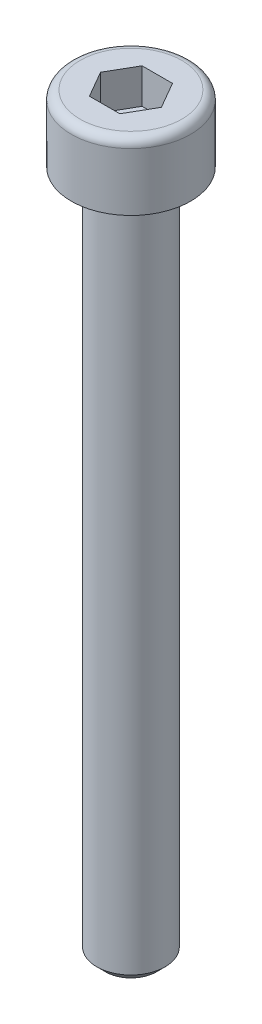
ISO-10303-21;
HEADER;
FILE_DESCRIPTION(('STEP AP214'),'2;1');
FILE_NAME('part.step','',(''),(''),'','','');
FILE_SCHEMA(('AUTOMOTIVE_DESIGN { 1 0 10303 214 1 1 1 1 }'));
ENDSEC;
DATA;
#1=APPLICATION_CONTEXT('core data for automotive mechanical design processes');
#2=APPLICATION_PROTOCOL_DEFINITION('international standard','automotive_design',2000,#1);
#3=PRODUCT_CONTEXT('',#1,'mechanical');
#4=PRODUCT('Part','Part','',(#3));
#5=PRODUCT_RELATED_PRODUCT_CATEGORY('part','',(#4));
#6=PRODUCT_DEFINITION_FORMATION('','',#4);
#7=PRODUCT_DEFINITION_CONTEXT('part definition',#1,'design');
#8=PRODUCT_DEFINITION('design','',#6,#7);
#9=PRODUCT_DEFINITION_SHAPE('','',#8);
#10=(LENGTH_UNIT() NAMED_UNIT(*) SI_UNIT(.MILLI.,.METRE.));
#11=(NAMED_UNIT(*) PLANE_ANGLE_UNIT() SI_UNIT($,.RADIAN.));
#12=(NAMED_UNIT(*) SI_UNIT($,.STERADIAN.) SOLID_ANGLE_UNIT());
#13=UNCERTAINTY_MEASURE_WITH_UNIT(LENGTH_MEASURE(1.E-05),#10,'distance_accuracy_value','');
#14=(GEOMETRIC_REPRESENTATION_CONTEXT(3) GLOBAL_UNCERTAINTY_ASSIGNED_CONTEXT((#13)) GLOBAL_UNIT_ASSIGNED_CONTEXT((#10,
#11,#12)) REPRESENTATION_CONTEXT('',''));
#15=CARTESIAN_POINT('',(0.,0.,0.));
#16=DIRECTION('',(0.,0.,1.));
#17=DIRECTION('',(1.,0.,0.));
#18=AXIS2_PLACEMENT_3D('',#15,#16,#17);
#19=CARTESIAN_POINT('',(0.,3.8,0.));
#20=DIRECTION('',(0.,1.,0.));
#21=DIRECTION('',(-1.,0.,0.));
#22=AXIS2_PLACEMENT_3D('',#19,#20,#21);
#23=PLANE('',#22);
#24=DIRECTION('',(0.5,0.,-0.866025403784439));
#25=VECTOR('',#24,1.);
#26=CARTESIAN_POINT('',(0.866025403784438,3.8,1.5));
#27=LINE('',#26,#25);
#28=CARTESIAN_POINT('',(0.866025403784438,3.8,1.5));
#29=VERTEX_POINT('',#28);
#30=CARTESIAN_POINT('',(1.73205080756888,3.8,0.));
#31=VERTEX_POINT('',#30);
#32=EDGE_CURVE('E44',#29,#31,#27,.T.);
#33=ORIENTED_EDGE('',*,*,#32,.F.);
#34=DIRECTION('',(1.,0.,0.));
#35=VECTOR('',#34,1.);
#36=CARTESIAN_POINT('',(-0.86602540378444,3.8,1.5));
#37=LINE('',#36,#35);
#38=CARTESIAN_POINT('',(-0.86602540378444,3.8,1.5));
#39=VERTEX_POINT('',#38);
#40=EDGE_CURVE('E127',#39,#29,#37,.T.);
#41=ORIENTED_EDGE('',*,*,#40,.F.);
#42=DIRECTION('',(0.5,0.,0.866025403784439));
#43=VECTOR('',#42,1.);
#44=CARTESIAN_POINT('',(-1.73205080756888,3.8,0.));
#45=LINE('',#44,#43);
#46=CARTESIAN_POINT('',(-1.73205080756888,3.8,0.));
#47=VERTEX_POINT('',#46);
#48=EDGE_CURVE('E125',#47,#39,#45,.T.);
#49=ORIENTED_EDGE('',*,*,#48,.F.);
#50=DIRECTION('',(-0.5,0.,0.866025403784439));
#51=VECTOR('',#50,1.);
#52=CARTESIAN_POINT('',(-0.866025403784439,3.8,-1.5));
#53=LINE('',#52,#51);
#54=CARTESIAN_POINT('',(-0.866025403784439,3.8,-1.5));
#55=VERTEX_POINT('',#54);
#56=EDGE_CURVE('E92',#55,#47,#53,.T.);
#57=ORIENTED_EDGE('',*,*,#56,.F.);
#58=DIRECTION('',(-1.,0.,0.));
#59=VECTOR('',#58,1.);
#60=CARTESIAN_POINT('',(0.866025403784439,3.8,-1.5));
#61=LINE('',#60,#59);
#62=CARTESIAN_POINT('',(0.866025403784439,3.8,-1.5));
#63=VERTEX_POINT('',#62);
#64=EDGE_CURVE('E121',#63,#55,#61,.T.);
#65=ORIENTED_EDGE('',*,*,#64,.F.);
#66=DIRECTION('',(-0.5,0.,-0.866025403784439));
#67=VECTOR('',#66,1.);
#68=CARTESIAN_POINT('',(1.73205080756888,3.8,0.));
#69=LINE('',#68,#67);
#70=EDGE_CURVE('E118',#31,#63,#69,.T.);
#71=ORIENTED_EDGE('',*,*,#70,.F.);
#72=EDGE_LOOP('',(#33,#41,#49,#57,#65,#71));
#73=FACE_BOUND('',#72,.T.);
#74=CARTESIAN_POINT('',(0.,3.8,0.));
#75=DIRECTION('',(0.,1.,0.));
#76=DIRECTION('',(-1.,0.,0.));
#77=AXIS2_PLACEMENT_3D('',#74,#75,#76);
#78=CIRCLE('',#77,2.9);
#79=CARTESIAN_POINT('',(-2.9,3.8,0.));
#80=VERTEX_POINT('',#79);
#81=EDGE_CURVE('E11',#80,#80,#78,.T.);
#82=ORIENTED_EDGE('',*,*,#81,.T.);
#83=EDGE_LOOP('',(#82));
#84=FACE_BOUND('',#83,.T.);
#85=ADVANCED_FACE('F30',(#73,#84),#23,.T.);
#86=CARTESIAN_POINT('',(0.,3.3,0.));
#87=DIRECTION('',(0.,1.,0.));
#88=DIRECTION('',(-1.,0.,0.));
#89=AXIS2_PLACEMENT_3D('',#86,#87,#88);
#90=TOROIDAL_SURFACE('',#89,2.9,0.5);
#91=CARTESIAN_POINT('',(0.,3.3,0.));
#92=DIRECTION('',(0.,1.,0.));
#93=DIRECTION('',(-1.,0.,0.));
#94=AXIS2_PLACEMENT_3D('',#91,#92,#93);
#95=CIRCLE('',#94,3.4);
#96=CARTESIAN_POINT('',(-3.4,3.3,0.));
#97=VERTEX_POINT('',#96);
#98=EDGE_CURVE('E37',#97,#97,#95,.T.);
#99=ORIENTED_EDGE('',*,*,#98,.T.);
#100=EDGE_LOOP('',(#99));
#101=FACE_BOUND('',#100,.T.);
#102=ORIENTED_EDGE('',*,*,#81,.F.);
#103=EDGE_LOOP('',(#102));
#104=FACE_BOUND('',#103,.T.);
#105=ADVANCED_FACE('F150',(#101,#104),#90,.T.);
#106=CARTESIAN_POINT('',(0.,3.8,0.));
#107=DIRECTION('',(0.,1.,0.));
#108=DIRECTION('',(-1.,0.,0.));
#109=AXIS2_PLACEMENT_3D('',#106,#107,#108);
#110=CYLINDRICAL_SURFACE('',#109,3.4);
#111=CARTESIAN_POINT('',(0.,0.,0.));
#112=DIRECTION('',(0.,1.,0.));
#113=DIRECTION('',(-1.,0.,0.));
#114=AXIS2_PLACEMENT_3D('',#111,#112,#113);
#115=CIRCLE('',#114,3.4);
#116=CARTESIAN_POINT('',(-3.4,0.,0.));
#117=VERTEX_POINT('',#116);
#118=EDGE_CURVE('E145',#117,#117,#115,.T.);
#119=ORIENTED_EDGE('',*,*,#118,.T.);
#120=EDGE_LOOP('',(#119));
#121=FACE_BOUND('',#120,.T.);
#122=ORIENTED_EDGE('',*,*,#98,.F.);
#123=EDGE_LOOP('',(#122));
#124=FACE_BOUND('',#123,.T.);
#125=ADVANCED_FACE('F153',(#121,#124),#110,.T.);
#126=CARTESIAN_POINT('',(-3.4,0.,0.));
#127=DIRECTION('',(0.,-1.,0.));
#128=DIRECTION('',(1.,0.,0.));
#129=AXIS2_PLACEMENT_3D('',#126,#127,#128);
#130=PLANE('',#129);
#131=CARTESIAN_POINT('',(0.,0.,0.));
#132=DIRECTION('',(0.,1.,0.));
#133=DIRECTION('',(-1.,0.,0.));
#134=AXIS2_PLACEMENT_3D('',#131,#132,#133);
#135=CIRCLE('',#134,1.95);
#136=CARTESIAN_POINT('',(-1.95,0.,0.));
#137=VERTEX_POINT('',#136);
#138=EDGE_CURVE('E142',#137,#137,#135,.T.);
#139=ORIENTED_EDGE('',*,*,#138,.T.);
#140=EDGE_LOOP('',(#139));
#141=FACE_BOUND('',#140,.T.);
#142=ORIENTED_EDGE('',*,*,#118,.F.);
#143=EDGE_LOOP('',(#142));
#144=FACE_BOUND('',#143,.T.);
#145=ADVANCED_FACE('F155',(#141,#144),#130,.T.);
#146=CARTESIAN_POINT('',(0.,3.8,0.));
#147=DIRECTION('',(0.,1.,0.));
#148=DIRECTION('',(-1.,0.,0.));
#149=AXIS2_PLACEMENT_3D('',#146,#147,#148);
#150=CYLINDRICAL_SURFACE('',#149,1.95);
#151=CARTESIAN_POINT('',(0.,-38.5,0.));
#152=DIRECTION('',(0.,1.,0.));
#153=DIRECTION('',(-1.,0.,0.));
#154=AXIS2_PLACEMENT_3D('',#151,#152,#153);
#155=CIRCLE('',#154,1.95);
#156=CARTESIAN_POINT('',(-1.94999999999999,-38.5,0.));
#157=VERTEX_POINT('',#156);
#158=EDGE_CURVE('E139',#157,#157,#155,.T.);
#159=ORIENTED_EDGE('',*,*,#158,.T.);
#160=EDGE_LOOP('',(#159));
#161=FACE_BOUND('',#160,.T.);
#162=ORIENTED_EDGE('',*,*,#138,.F.);
#163=EDGE_LOOP('',(#162));
#164=FACE_BOUND('',#163,.T.);
#165=ADVANCED_FACE('F162',(#161,#164),#150,.T.);
#166=CARTESIAN_POINT('',(0.,-38.5,0.));
#167=DIRECTION('',(0.,1.,0.));
#168=DIRECTION('',(-1.,0.,0.));
#169=AXIS2_PLACEMENT_3D('',#166,#167,#168);
#170=CONICAL_SURFACE('',#169,1.95,0.785398163397448);
#171=CARTESIAN_POINT('',(0.,-39.,0.));
#172=DIRECTION('',(0.,1.,0.));
#173=DIRECTION('',(-1.,0.,0.));
#174=AXIS2_PLACEMENT_3D('',#171,#172,#173);
#175=CIRCLE('',#174,1.45);
#176=CARTESIAN_POINT('',(-1.44999999999999,-39.,0.));
#177=VERTEX_POINT('',#176);
#178=EDGE_CURVE('E131',#177,#177,#175,.T.);
#179=ORIENTED_EDGE('',*,*,#178,.T.);
#180=EDGE_LOOP('',(#179));
#181=FACE_BOUND('',#180,.T.);
#182=ORIENTED_EDGE('',*,*,#158,.F.);
#183=EDGE_LOOP('',(#182));
#184=FACE_BOUND('',#183,.T.);
#185=ADVANCED_FACE('F187',(#181,#184),#170,.T.);
#186=CARTESIAN_POINT('',(-1.44999999999999,-39.,0.));
#187=DIRECTION('',(0.,-1.,0.));
#188=DIRECTION('',(1.,0.,0.));
#189=AXIS2_PLACEMENT_3D('',#186,#187,#188);
#190=PLANE('',#189);
#191=ORIENTED_EDGE('',*,*,#178,.F.);
#192=EDGE_LOOP('',(#191));
#193=FACE_BOUND('',#192,.T.);
#194=ADVANCED_FACE('F180',(#193),#190,.T.);
#195=CARTESIAN_POINT('',(0.866025403784438,1.8,1.5));
#196=DIRECTION('',(0.866025403784439,0.,0.5));
#197=DIRECTION('',(0.5,0.,-0.866025403784439));
#198=AXIS2_PLACEMENT_3D('',#195,#196,#197);
#199=PLANE('',#198);
#200=ORIENTED_EDGE('',*,*,#32,.T.);
#201=DIRECTION('',(0.,1.,0.));
#202=VECTOR('',#201,1.);
#203=CARTESIAN_POINT('',(1.73205080756888,1.8,0.));
#204=LINE('',#203,#202);
#205=CARTESIAN_POINT('',(1.73205080756888,1.8,0.));
#206=VERTEX_POINT('',#205);
#207=EDGE_CURVE('E74',#206,#31,#204,.T.);
#208=ORIENTED_EDGE('',*,*,#207,.F.);
#209=DIRECTION('',(0.5,0.,-0.866025403784439));
#210=VECTOR('',#209,1.);
#211=CARTESIAN_POINT('',(0.866025403784438,1.8,1.5));
#212=LINE('',#211,#210);
#213=CARTESIAN_POINT('',(0.866025403784438,1.8,1.5));
#214=VERTEX_POINT('',#213);
#215=EDGE_CURVE('E129',#214,#206,#212,.T.);
#216=ORIENTED_EDGE('',*,*,#215,.F.);
#217=DIRECTION('',(0.,1.,0.));
#218=VECTOR('',#217,1.);
#219=CARTESIAN_POINT('',(0.866025403784438,1.8,1.5));
#220=LINE('',#219,#218);
#221=EDGE_CURVE('E52',#214,#29,#220,.T.);
#222=ORIENTED_EDGE('',*,*,#221,.T.);
#223=EDGE_LOOP('',(#200,#208,#216,#222));
#224=FACE_BOUND('',#223,.T.);
#225=ADVANCED_FACE('F177',(#224),#199,.F.);
#226=CARTESIAN_POINT('',(-0.86602540378444,1.8,1.5));
#227=DIRECTION('',(0.,0.,1.));
#228=DIRECTION('',(1.,0.,0.));
#229=AXIS2_PLACEMENT_3D('',#226,#227,#228);
#230=PLANE('',#229);
#231=ORIENTED_EDGE('',*,*,#40,.T.);
#232=ORIENTED_EDGE('',*,*,#221,.F.);
#233=DIRECTION('',(1.,0.,0.));
#234=VECTOR('',#233,1.);
#235=CARTESIAN_POINT('',(-0.86602540378444,1.8,1.5));
#236=LINE('',#235,#234);
#237=CARTESIAN_POINT('',(-0.86602540378444,1.8,1.5));
#238=VERTEX_POINT('',#237);
#239=EDGE_CURVE('E104',#238,#214,#236,.T.);
#240=ORIENTED_EDGE('',*,*,#239,.F.);
#241=DIRECTION('',(0.,1.,0.));
#242=VECTOR('',#241,1.);
#243=CARTESIAN_POINT('',(-0.86602540378444,1.8,1.5));
#244=LINE('',#243,#242);
#245=EDGE_CURVE('E96',#238,#39,#244,.T.);
#246=ORIENTED_EDGE('',*,*,#245,.T.);
#247=EDGE_LOOP('',(#231,#232,#240,#246));
#248=FACE_BOUND('',#247,.T.);
#249=ADVANCED_FACE('F179',(#248),#230,.F.);
#250=CARTESIAN_POINT('',(-1.73205080756888,1.8,0.));
#251=DIRECTION('',(-0.866025403784439,0.,0.5));
#252=DIRECTION('',(0.5,0.,0.866025403784439));
#253=AXIS2_PLACEMENT_3D('',#250,#251,#252);
#254=PLANE('',#253);
#255=ORIENTED_EDGE('',*,*,#48,.T.);
#256=ORIENTED_EDGE('',*,*,#245,.F.);
#257=DIRECTION('',(0.5,0.,0.866025403784439));
#258=VECTOR('',#257,1.);
#259=CARTESIAN_POINT('',(-1.73205080756888,1.8,0.));
#260=LINE('',#259,#258);
#261=CARTESIAN_POINT('',(-1.73205080756888,1.8,0.));
#262=VERTEX_POINT('',#261);
#263=EDGE_CURVE('E100',#262,#238,#260,.T.);
#264=ORIENTED_EDGE('',*,*,#263,.F.);
#265=DIRECTION('',(0.,1.,0.));
#266=VECTOR('',#265,1.);
#267=CARTESIAN_POINT('',(-1.73205080756888,1.8,0.));
#268=LINE('',#267,#266);
#269=EDGE_CURVE('E85',#262,#47,#268,.T.);
#270=ORIENTED_EDGE('',*,*,#269,.T.);
#271=EDGE_LOOP('',(#255,#256,#264,#270));
#272=FACE_BOUND('',#271,.T.);
#273=ADVANCED_FACE('F101',(#272),#254,.F.);
#274=CARTESIAN_POINT('',(-0.866025403784438,1.8,-1.5));
#275=DIRECTION('',(-0.866025403784439,0.,-0.5));
#276=DIRECTION('',(-0.5,0.,0.866025403784439));
#277=AXIS2_PLACEMENT_3D('',#274,#275,#276);
#278=PLANE('',#277);
#279=ORIENTED_EDGE('',*,*,#56,.T.);
#280=ORIENTED_EDGE('',*,*,#269,.F.);
#281=DIRECTION('',(-0.5,0.,0.866025403784439));
#282=VECTOR('',#281,1.);
#283=CARTESIAN_POINT('',(-0.866025403784438,1.8,-1.5));
#284=LINE('',#283,#282);
#285=CARTESIAN_POINT('',(-0.866025403784438,1.8,-1.5));
#286=VERTEX_POINT('',#285);
#287=EDGE_CURVE('E89',#286,#262,#284,.T.);
#288=ORIENTED_EDGE('',*,*,#287,.F.);
#289=DIRECTION('',(0.,1.,0.));
#290=VECTOR('',#289,1.);
#291=CARTESIAN_POINT('',(-0.866025403784438,1.8,-1.5));
#292=LINE('',#291,#290);
#293=EDGE_CURVE('E97',#286,#55,#292,.T.);
#294=ORIENTED_EDGE('',*,*,#293,.T.);
#295=EDGE_LOOP('',(#279,#280,#288,#294));
#296=FACE_BOUND('',#295,.T.);
#297=ADVANCED_FACE('F87',(#296),#278,.F.);
#298=CARTESIAN_POINT('',(0.866025403784439,1.8,-1.5));
#299=DIRECTION('',(0.,0.,-1.));
#300=DIRECTION('',(-1.,0.,0.));
#301=AXIS2_PLACEMENT_3D('',#298,#299,#300);
#302=PLANE('',#301);
#303=ORIENTED_EDGE('',*,*,#64,.T.);
#304=ORIENTED_EDGE('',*,*,#293,.F.);
#305=DIRECTION('',(-1.,0.,0.));
#306=VECTOR('',#305,1.);
#307=CARTESIAN_POINT('',(0.866025403784439,1.8,-1.5));
#308=LINE('',#307,#306);
#309=CARTESIAN_POINT('',(0.866025403784439,1.8,-1.5));
#310=VERTEX_POINT('',#309);
#311=EDGE_CURVE('E110',#310,#286,#308,.T.);
#312=ORIENTED_EDGE('',*,*,#311,.F.);
#313=DIRECTION('',(0.,1.,0.));
#314=VECTOR('',#313,1.);
#315=CARTESIAN_POINT('',(0.866025403784439,1.8,-1.5));
#316=LINE('',#315,#314);
#317=EDGE_CURVE('E134',#310,#63,#316,.T.);
#318=ORIENTED_EDGE('',*,*,#317,.T.);
#319=EDGE_LOOP('',(#303,#304,#312,#318));
#320=FACE_BOUND('',#319,.T.);
#321=ADVANCED_FACE('F248',(#320),#302,.F.);
#322=CARTESIAN_POINT('',(1.73205080756888,1.8,0.));
#323=DIRECTION('',(0.866025403784439,0.,-0.5));
#324=DIRECTION('',(-0.5,0.,-0.866025403784439));
#325=AXIS2_PLACEMENT_3D('',#322,#323,#324);
#326=PLANE('',#325);
#327=ORIENTED_EDGE('',*,*,#70,.T.);
#328=ORIENTED_EDGE('',*,*,#317,.F.);
#329=DIRECTION('',(-0.5,0.,-0.866025403784439));
#330=VECTOR('',#329,1.);
#331=CARTESIAN_POINT('',(1.73205080756888,1.8,0.));
#332=LINE('',#331,#330);
#333=EDGE_CURVE('E112',#206,#310,#332,.T.);
#334=ORIENTED_EDGE('',*,*,#333,.F.);
#335=ORIENTED_EDGE('',*,*,#207,.T.);
#336=EDGE_LOOP('',(#327,#328,#334,#335));
#337=FACE_BOUND('',#336,.T.);
#338=ADVANCED_FACE('F175',(#337),#326,.F.);
#339=CARTESIAN_POINT('',(2.59807621135332,1.8,-1.5));
#340=DIRECTION('',(0.,1.,0.));
#341=DIRECTION('',(0.,0.,1.));
#342=AXIS2_PLACEMENT_3D('',#339,#340,#341);
#343=PLANE('',#342);
#344=ORIENTED_EDGE('',*,*,#215,.T.);
#345=ORIENTED_EDGE('',*,*,#333,.T.);
#346=ORIENTED_EDGE('',*,*,#311,.T.);
#347=ORIENTED_EDGE('',*,*,#287,.T.);
#348=ORIENTED_EDGE('',*,*,#263,.T.);
#349=ORIENTED_EDGE('',*,*,#239,.T.);
#350=EDGE_LOOP('',(#344,#345,#346,#347,#348,#349));
#351=FACE_BOUND('',#350,.T.);
#352=ADVANCED_FACE('F107',(#351),#343,.T.);
#353=CLOSED_SHELL('',(#85,#105,#125,#145,#165,#185,#194,#225,#249,#273,#297,#321,#338,#352));
#354=MANIFOLD_SOLID_BREP('B2',#353);
#355=ADVANCED_BREP_SHAPE_REPRESENTATION('',(#18,#354),#14);
#356=SHAPE_DEFINITION_REPRESENTATION(#9,#355);
ENDSEC;
END-ISO-10303-21;
